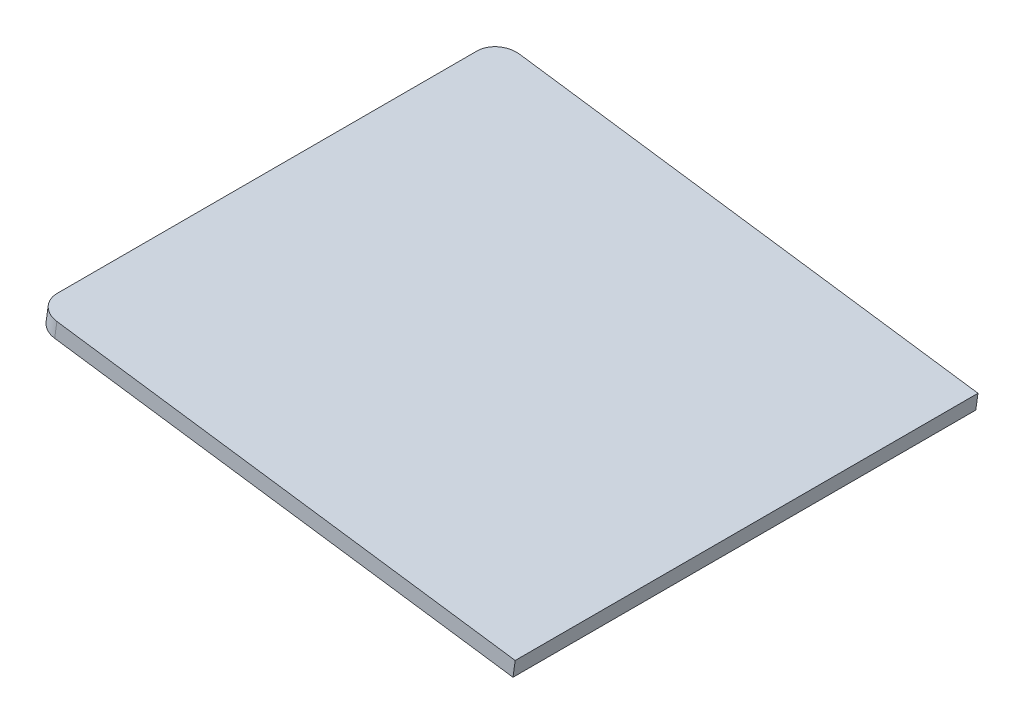
ISO-10303-21;
HEADER;
FILE_DESCRIPTION(('STEP AP214'),'2;1');
FILE_NAME('part.step','',(''),(''),'','','');
FILE_SCHEMA(('AUTOMOTIVE_DESIGN { 1 0 10303 214 1 1 1 1 }'));
ENDSEC;
DATA;
#1=APPLICATION_CONTEXT('core data for automotive mechanical design processes');
#2=APPLICATION_PROTOCOL_DEFINITION('international standard','automotive_design',2000,#1);
#3=PRODUCT_CONTEXT('',#1,'mechanical');
#4=PRODUCT('Part','Part','',(#3));
#5=PRODUCT_RELATED_PRODUCT_CATEGORY('part','',(#4));
#6=PRODUCT_DEFINITION_FORMATION('','',#4);
#7=PRODUCT_DEFINITION_CONTEXT('part definition',#1,'design');
#8=PRODUCT_DEFINITION('design','',#6,#7);
#9=PRODUCT_DEFINITION_SHAPE('','',#8);
#10=(LENGTH_UNIT() NAMED_UNIT(*) SI_UNIT(.MILLI.,.METRE.));
#11=(NAMED_UNIT(*) PLANE_ANGLE_UNIT() SI_UNIT($,.RADIAN.));
#12=(NAMED_UNIT(*) SI_UNIT($,.STERADIAN.) SOLID_ANGLE_UNIT());
#13=UNCERTAINTY_MEASURE_WITH_UNIT(LENGTH_MEASURE(1.E-05),#10,'distance_accuracy_value','');
#14=(GEOMETRIC_REPRESENTATION_CONTEXT(3) GLOBAL_UNCERTAINTY_ASSIGNED_CONTEXT((#13)) GLOBAL_UNIT_ASSIGNED_CONTEXT((#10,
#11,#12)) REPRESENTATION_CONTEXT('',''));
#15=CARTESIAN_POINT('',(0.,0.,0.));
#16=DIRECTION('',(0.,0.,1.));
#17=DIRECTION('',(1.,0.,0.));
#18=AXIS2_PLACEMENT_3D('',#15,#16,#17);
#19=CARTESIAN_POINT('',(307.28964130325,623.29945517815,615.));
#20=DIRECTION('',(-0.139173100960097,-0.990268068741566,0.));
#21=DIRECTION('',(0.990268068741566,-0.139173100960097,0.));
#22=AXIS2_PLACEMENT_3D('',#19,#20,#21);
#23=PLANE('',#22);
#24=DIRECTION('',(0.,0.,1.));
#25=VECTOR('',#24,1.);
#26=CARTESIAN_POINT('',(-252.2118175357,701.9322572206,615.));
#27=LINE('',#26,#25);
#28=CARTESIAN_POINT('',(-252.211817535484,701.932257222141,124.999999999665));
#29=VERTEX_POINT('',#28);
#30=CARTESIAN_POINT('',(-252.211673120396,701.932236924897,1105.0000300743));
#31=VERTEX_POINT('',#30);
#32=EDGE_CURVE('E79',#29,#31,#27,.T.);
#33=ORIENTED_EDGE('',*,*,#32,.F.);
#34=CARTESIAN_POINT('',(-202.698414098108,694.973602173377,124.999999999666));
#35=DIRECTION('',(0.139173101004969,0.99026806873526,0.));
#36=DIRECTION('',(-0.99026806873526,0.139173101004969,0.));
#37=AXIS2_PLACEMENT_3D('',#34,#35,#36);
#38=CIRCLE('',#37,49.9999999998998);
#39=CARTESIAN_POINT('',(-202.698414098336,694.973602172982,75.));
#40=VERTEX_POINT('',#39);
#41=EDGE_CURVE('E87',#29,#40,#38,.F.);
#42=ORIENTED_EDGE('',*,*,#41,.T.);
#43=DIRECTION('',(-0.990268068741566,0.139173100960097,0.));
#44=VECTOR('',#43,1.);
#45=CARTESIAN_POINT('',(866.7911001422,544.6666531357,75.));
#46=LINE('',#45,#44);
#47=CARTESIAN_POINT('',(866.7911001422,544.6666531357,75.));
#48=VERTEX_POINT('',#47);
#49=EDGE_CURVE('E104',#48,#40,#46,.T.);
#50=ORIENTED_EDGE('',*,*,#49,.F.);
#51=DIRECTION('',(0.,0.,1.));
#52=VECTOR('',#51,1.);
#53=CARTESIAN_POINT('',(866.7911001422,544.6666531357,615.));
#54=LINE('',#53,#52);
#55=CARTESIAN_POINT('',(866.7911001422,544.6666531357,1155.));
#56=VERTEX_POINT('',#55);
#57=EDGE_CURVE('E114',#56,#48,#54,.F.);
#58=ORIENTED_EDGE('',*,*,#57,.F.);
#59=DIRECTION('',(0.990268068741566,-0.139173100960097,0.));
#60=VECTOR('',#59,1.);
#61=CARTESIAN_POINT('',(-202.698414098601,694.973602172592,1155.));
#62=LINE('',#61,#60);
#63=CARTESIAN_POINT('',(-202.698414099093,694.973602171221,1155.0000471078));
#64=VERTEX_POINT('',#63);
#65=EDGE_CURVE('E121',#64,#56,#62,.T.);
#66=ORIENTED_EDGE('',*,*,#65,.F.);
#67=CARTESIAN_POINT('',(-202.698127269172,694.973561858206,1105.00009623663));
#68=DIRECTION('',(0.139173101038861,0.990268068730496,5.92796356399104E-11));
#69=DIRECTION('',(-0.990268068730496,0.139173101038861,0.));
#70=AXIS2_PLACEMENT_3D('',#67,#68,#69);
#71=CIRCLE('',#70,49.9999979798085);
#72=EDGE_CURVE('E170',#64,#31,#71,.F.);
#73=ORIENTED_EDGE('',*,*,#72,.T.);
#74=EDGE_LOOP('',(#33,#42,#50,#58,#66,#73));
#75=FACE_BOUND('',#74,.T.);
#76=ADVANCED_FACE('F18',(#75),#23,.T.);
#77=CARTESIAN_POINT('',(-835241.304443913,-5940913.43880939,125.000000000006));
#78=DIRECTION('',(0.139173101004969,0.99026806873526,0.));
#79=DIRECTION('',(-0.99026806873526,0.139173101004969,0.));
#80=AXIS2_PLACEMENT_3D('',#77,#78,#79);
#81=CYLINDRICAL_SURFACE('',#80,49.9999999998998);
#82=ORIENTED_EDGE('',*,*,#41,.F.);
#83=DIRECTION('',(-0.139173100959612,-0.990268068741634,0.));
#84=VECTOR('',#83,1.);
#85=CARTESIAN_POINT('',(-249.63711516795,720.2522164923,124.999999999665));
#86=LINE('',#85,#84);
#87=CARTESIAN_POINT('',(-247.062412800174,738.572175764189,124.999999999665));
#88=VERTEX_POINT('',#87);
#89=EDGE_CURVE('E195',#88,#29,#86,.T.);
#90=ORIENTED_EDGE('',*,*,#89,.F.);
#91=CARTESIAN_POINT('',(-197.549009361296,731.613520713836,124.999999999666));
#92=DIRECTION('',(0.139173101004969,0.99026806873526,0.));
#93=DIRECTION('',(-0.99026806873526,0.139173101004969,0.));
#94=AXIS2_PLACEMENT_3D('',#91,#92,#93);
#95=CIRCLE('',#94,49.9999999998998);
#96=CARTESIAN_POINT('',(-197.549009362192,731.613520714914,75.));
#97=VERTEX_POINT('',#96);
#98=EDGE_CURVE('E72',#88,#97,#95,.F.);
#99=ORIENTED_EDGE('',*,*,#98,.T.);
#100=DIRECTION('',(0.139173100958959,0.990268068741726,0.));
#101=VECTOR('',#100,1.);
#102=CARTESIAN_POINT('',(-202.698414098446,694.973602173425,75.));
#103=LINE('',#102,#101);
#104=EDGE_CURVE('E65',#40,#97,#103,.T.);
#105=ORIENTED_EDGE('',*,*,#104,.F.);
#106=EDGE_LOOP('',(#82,#90,#99,#105));
#107=FACE_BOUND('',#106,.T.);
#108=ADVANCED_FACE('F112',(#107),#81,.T.);
#109=CARTESIAN_POINT('',(334.621045389575,638.14008692585,75.));
#110=DIRECTION('',(0.,0.,-1.));
#111=DIRECTION('',(0.,1.,0.));
#112=AXIS2_PLACEMENT_3D('',#109,#110,#111);
#113=PLANE('',#112);
#114=ORIENTED_EDGE('',*,*,#49,.T.);
#115=ORIENTED_EDGE('',*,*,#104,.T.);
#116=DIRECTION('',(0.990268068741568,-0.139173100960085,0.));
#117=VECTOR('',#116,1.);
#118=CARTESIAN_POINT('',(-197.549009363092,731.613520715992,75.));
#119=LINE('',#118,#117);
#120=CARTESIAN_POINT('',(871.9405048778,581.3065716791,75.));
#121=VERTEX_POINT('',#120);
#122=EDGE_CURVE('E185',#97,#121,#119,.T.);
#123=ORIENTED_EDGE('',*,*,#122,.T.);
#124=DIRECTION('',(0.139173100962263,0.990268068741261,0.));
#125=VECTOR('',#124,1.);
#126=CARTESIAN_POINT('',(869.36580251,562.9866124074,75.));
#127=LINE('',#126,#125);
#128=EDGE_CURVE('E106',#48,#121,#127,.T.);
#129=ORIENTED_EDGE('',*,*,#128,.F.);
#130=EDGE_LOOP('',(#114,#115,#123,#129));
#131=FACE_BOUND('',#130,.T.);
#132=ADVANCED_FACE('F105',(#131),#113,.T.);
#133=CARTESIAN_POINT('',(869.36580251,562.9866124074,615.));
#134=DIRECTION('',(0.990268068741261,-0.139173100962263,0.));
#135=DIRECTION('',(0.139173100962263,0.990268068741261,0.));
#136=AXIS2_PLACEMENT_3D('',#133,#134,#135);
#137=PLANE('',#136);
#138=ORIENTED_EDGE('',*,*,#128,.T.);
#139=DIRECTION('',(0.,0.,1.));
#140=VECTOR('',#139,1.);
#141=CARTESIAN_POINT('',(871.9405048778,581.3065716791,615.));
#142=LINE('',#141,#140);
#143=CARTESIAN_POINT('',(871.9405048778,581.3065716791,1155.));
#144=VERTEX_POINT('',#143);
#145=EDGE_CURVE('E181',#121,#144,#142,.T.);
#146=ORIENTED_EDGE('',*,*,#145,.T.);
#147=DIRECTION('',(0.139173100962264,0.990268068741261,0.));
#148=VECTOR('',#147,1.);
#149=CARTESIAN_POINT('',(866.7911001422,544.6666531357,1155.));
#150=LINE('',#149,#148);
#151=EDGE_CURVE('E172',#56,#144,#150,.T.);
#152=ORIENTED_EDGE('',*,*,#151,.F.);
#153=ORIENTED_EDGE('',*,*,#57,.T.);
#154=EDGE_LOOP('',(#138,#146,#152,#153));
#155=FACE_BOUND('',#154,.T.);
#156=ADVANCED_FACE('F144',(#155),#137,.T.);
#157=CARTESIAN_POINT('',(334.621045389575,638.14008692585,1155.));
#158=DIRECTION('',(0.,0.,1.));
#159=DIRECTION('',(0.,-1.,0.));
#160=AXIS2_PLACEMENT_3D('',#157,#158,#159);
#161=PLANE('',#160);
#162=DIRECTION('',(-0.990268068741568,0.139173100960085,0.));
#163=VECTOR('',#162,1.);
#164=CARTESIAN_POINT('',(871.9405048778,581.3065716791,1155.));
#165=LINE('',#164,#163);
#166=CARTESIAN_POINT('',(-197.549009149456,731.613520433059,1155.00004710853));
#167=VERTEX_POINT('',#166);
#168=EDGE_CURVE('E175',#144,#167,#165,.T.);
#169=ORIENTED_EDGE('',*,*,#168,.T.);
#170=CARTESIAN_POINT('',(-197.549009396326,731.613520467754,1155.));
#171=DIRECTION('',(-0.139173101004976,-0.990268068735259,0.));
#172=VECTOR('',#171,1.);
#173=LINE('',#170,#172);
#174=EDGE_CURVE('E127',#167,#64,#173,.T.);
#175=ORIENTED_EDGE('',*,*,#174,.T.);
#176=ORIENTED_EDGE('',*,*,#65,.T.);
#177=ORIENTED_EDGE('',*,*,#151,.T.);
#178=EDGE_LOOP('',(#169,#175,#176,#177));
#179=FACE_BOUND('',#178,.T.);
#180=ADVANCED_FACE('F133',(#179),#161,.T.);
#181=CARTESIAN_POINT('',(-835241.304360434,-5940913.43882112,1104.99974055882));
#182=DIRECTION('',(0.139173101038861,0.990268068730496,5.92796356399104E-11));
#183=DIRECTION('',(-0.990268068730496,0.139173101038861,0.));
#184=AXIS2_PLACEMENT_3D('',#181,#182,#183);
#185=CYLINDRICAL_SURFACE('',#184,49.9999979798085);
#186=ORIENTED_EDGE('',*,*,#72,.F.);
#187=ORIENTED_EDGE('',*,*,#174,.F.);
#188=CARTESIAN_POINT('',(-197.548722529746,731.613480407759,1105.00009623882));
#189=DIRECTION('',(0.139173101038861,0.990268068730496,5.92796356399104E-11));
#190=DIRECTION('',(-0.990268068730496,0.139173101038861,0.));
#191=AXIS2_PLACEMENT_3D('',#188,#189,#190);
#192=CIRCLE('',#191,49.9999979798085);
#193=CARTESIAN_POINT('',(-247.062268418167,738.572155220246,1104.99999975028));
#194=VERTEX_POINT('',#193);
#195=EDGE_CURVE('E29',#167,#194,#192,.F.);
#196=ORIENTED_EDGE('',*,*,#195,.T.);
#197=CARTESIAN_POINT('',(-252.211817535707,701.932257220552,1105.00000000056));
#198=DIRECTION('',(0.139173100959612,0.990268068741634,0.));
#199=VECTOR('',#198,1.);
#200=LINE('',#197,#199);
#201=EDGE_CURVE('E40',#31,#194,#200,.T.);
#202=ORIENTED_EDGE('',*,*,#201,.F.);
#203=EDGE_LOOP('',(#186,#187,#196,#202));
#204=FACE_BOUND('',#203,.T.);
#205=ADVANCED_FACE('F143',(#204),#185,.T.);
#206=CARTESIAN_POINT('',(-249.63711516795,720.2522164923,615.));
#207=DIRECTION('',(-0.990268068741634,0.139173100959612,0.));
#208=DIRECTION('',(-0.139173100959612,-0.990268068741634,0.));
#209=AXIS2_PLACEMENT_3D('',#206,#207,#208);
#210=PLANE('',#209);
#211=DIRECTION('',(0.,0.,1.));
#212=VECTOR('',#211,1.);
#213=CARTESIAN_POINT('',(-247.0624128002,738.572175764,615.));
#214=LINE('',#213,#212);
#215=EDGE_CURVE('E11',#194,#88,#214,.F.);
#216=ORIENTED_EDGE('',*,*,#215,.T.);
#217=ORIENTED_EDGE('',*,*,#89,.T.);
#218=ORIENTED_EDGE('',*,*,#32,.T.);
#219=ORIENTED_EDGE('',*,*,#201,.T.);
#220=EDGE_LOOP('',(#216,#217,#218,#219));
#221=FACE_BOUND('',#220,.T.);
#222=ADVANCED_FACE('F148',(#221),#210,.T.);
#223=CARTESIAN_POINT('',(312.4390460388,659.93937372155,615.));
#224=DIRECTION('',(-0.139173100960085,-0.990268068741568,0.));
#225=DIRECTION('',(0.990268068741568,-0.139173100960085,0.));
#226=AXIS2_PLACEMENT_3D('',#223,#224,#225);
#227=PLANE('',#226);
#228=ORIENTED_EDGE('',*,*,#195,.F.);
#229=ORIENTED_EDGE('',*,*,#168,.F.);
#230=ORIENTED_EDGE('',*,*,#145,.F.);
#231=ORIENTED_EDGE('',*,*,#122,.F.);
#232=ORIENTED_EDGE('',*,*,#98,.F.);
#233=ORIENTED_EDGE('',*,*,#215,.F.);
#234=EDGE_LOOP('',(#228,#229,#230,#231,#232,#233));
#235=FACE_BOUND('',#234,.T.);
#236=ADVANCED_FACE('F20',(#235),#227,.F.);
#237=CLOSED_SHELL('',(#76,#108,#132,#156,#180,#205,#222,#236));
#238=MANIFOLD_SOLID_BREP('B1',#237);
#239=ADVANCED_BREP_SHAPE_REPRESENTATION('',(#18,#238),#14);
#240=SHAPE_DEFINITION_REPRESENTATION(#9,#239);
ENDSEC;
END-ISO-10303-21;
